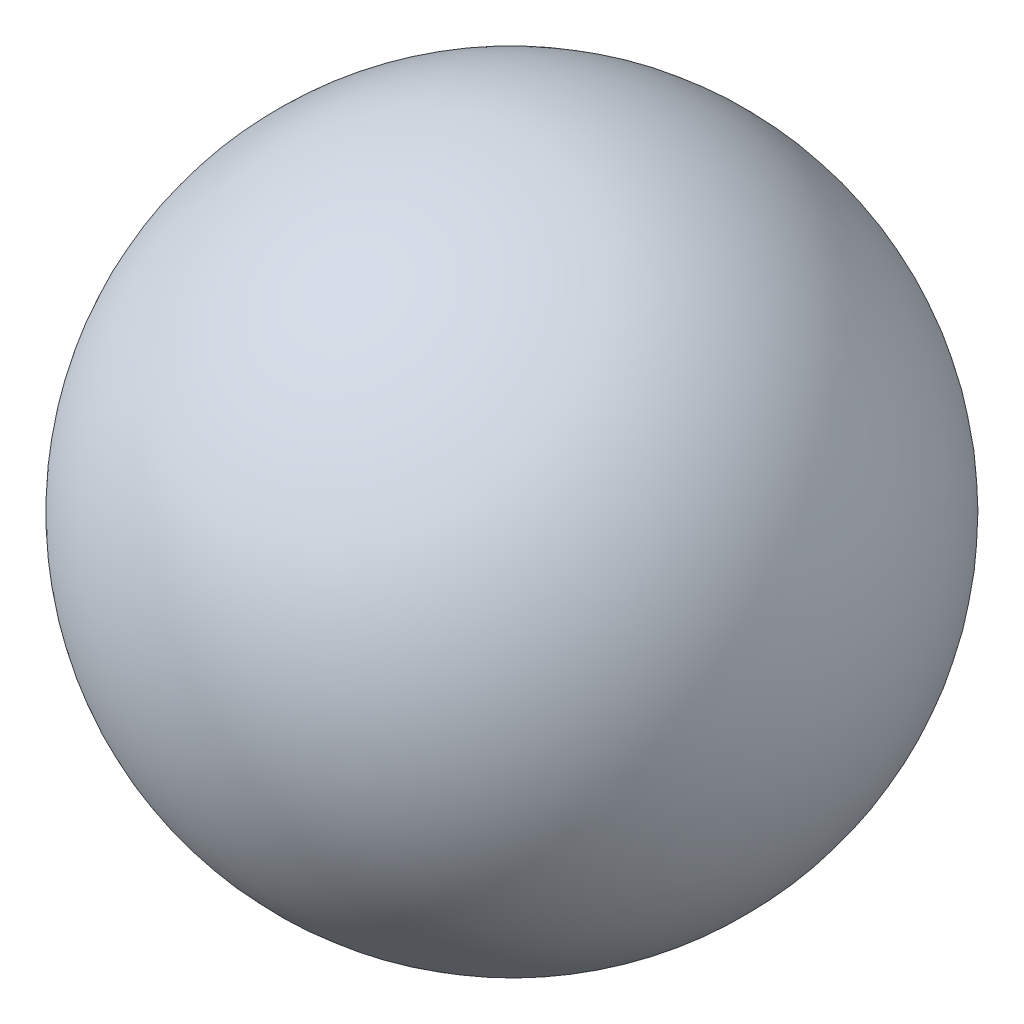
ISO-10303-21;
HEADER;
FILE_DESCRIPTION(('STEP AP214'),'2;1');
FILE_NAME('part.step','',(''),(''),'','','');
FILE_SCHEMA(('AUTOMOTIVE_DESIGN { 1 0 10303 214 1 1 1 1 }'));
ENDSEC;
DATA;
#1=APPLICATION_CONTEXT('core data for automotive mechanical design processes');
#2=APPLICATION_PROTOCOL_DEFINITION('international standard','automotive_design',2000,#1);
#3=PRODUCT_CONTEXT('',#1,'mechanical');
#4=PRODUCT('Part','Part','',(#3));
#5=PRODUCT_RELATED_PRODUCT_CATEGORY('part','',(#4));
#6=PRODUCT_DEFINITION_FORMATION('','',#4);
#7=PRODUCT_DEFINITION_CONTEXT('part definition',#1,'design');
#8=PRODUCT_DEFINITION('design','',#6,#7);
#9=PRODUCT_DEFINITION_SHAPE('','',#8);
#10=(LENGTH_UNIT() NAMED_UNIT(*) SI_UNIT(.MILLI.,.METRE.));
#11=(NAMED_UNIT(*) PLANE_ANGLE_UNIT() SI_UNIT($,.RADIAN.));
#12=(NAMED_UNIT(*) SI_UNIT($,.STERADIAN.) SOLID_ANGLE_UNIT());
#13=UNCERTAINTY_MEASURE_WITH_UNIT(LENGTH_MEASURE(1.E-05),#10,'distance_accuracy_value','');
#14=(GEOMETRIC_REPRESENTATION_CONTEXT(3) GLOBAL_UNCERTAINTY_ASSIGNED_CONTEXT((#13)) GLOBAL_UNIT_ASSIGNED_CONTEXT((#10,
#11,#12)) REPRESENTATION_CONTEXT('',''));
#15=CARTESIAN_POINT('',(0.,0.,0.));
#16=DIRECTION('',(0.,0.,1.));
#17=DIRECTION('',(1.,0.,0.));
#18=AXIS2_PLACEMENT_3D('',#15,#16,#17);
#19=CARTESIAN_POINT('',(0.,0.,0.));
#20=DIRECTION('',(-0.782530716087246,0.,-0.622611980594641));
#21=DIRECTION('',(0.622611980594641,0.,-0.782530716087246));
#22=AXIS2_PLACEMENT_3D('',#19,#20,#21);
#23=SPHERICAL_SURFACE('',#22,19.55);
#24=CARTESIAN_POINT('',(-15.2984754995057,0.,-12.1720642206252));
#25=VERTEX_POINT('',#24);
#26=VERTEX_LOOP('',#25);
#27=FACE_BOUND('',#26,.T.);
#28=ADVANCED_FACE('F38',(#27),#23,.T.);
#29=CLOSED_SHELL('',(#28));
#30=MANIFOLD_SOLID_BREP('B2',#29);
#31=ADVANCED_BREP_SHAPE_REPRESENTATION('',(#18,#30),#14);
#32=SHAPE_DEFINITION_REPRESENTATION(#9,#31);
ENDSEC;
END-ISO-10303-21;
